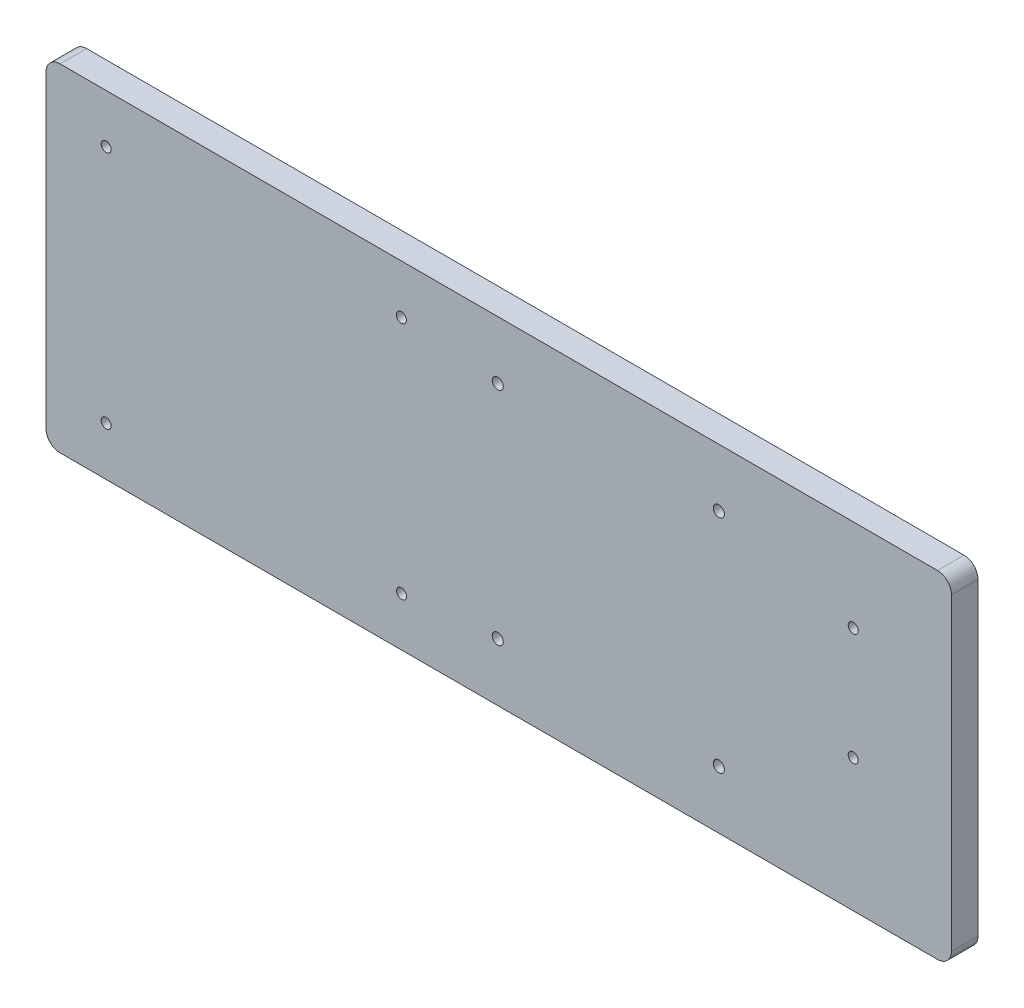
ISO-10303-21;
HEADER;
FILE_DESCRIPTION(('STEP AP214'),'2;1');
FILE_NAME('part.step','',(''),(''),'','','');
FILE_SCHEMA(('AUTOMOTIVE_DESIGN { 1 0 10303 214 1 1 1 1 }'));
ENDSEC;
DATA;
#1=APPLICATION_CONTEXT('core data for automotive mechanical design processes');
#2=APPLICATION_PROTOCOL_DEFINITION('international standard','automotive_design',2000,#1);
#3=PRODUCT_CONTEXT('',#1,'mechanical');
#4=PRODUCT('Part','Part','',(#3));
#5=PRODUCT_RELATED_PRODUCT_CATEGORY('part','',(#4));
#6=PRODUCT_DEFINITION_FORMATION('','',#4);
#7=PRODUCT_DEFINITION_CONTEXT('part definition',#1,'design');
#8=PRODUCT_DEFINITION('design','',#6,#7);
#9=PRODUCT_DEFINITION_SHAPE('','',#8);
#10=(LENGTH_UNIT() NAMED_UNIT(*) SI_UNIT(.MILLI.,.METRE.));
#11=(NAMED_UNIT(*) PLANE_ANGLE_UNIT() SI_UNIT($,.RADIAN.));
#12=(NAMED_UNIT(*) SI_UNIT($,.STERADIAN.) SOLID_ANGLE_UNIT());
#13=UNCERTAINTY_MEASURE_WITH_UNIT(LENGTH_MEASURE(1.E-05),#10,'distance_accuracy_value','');
#14=(GEOMETRIC_REPRESENTATION_CONTEXT(3) GLOBAL_UNCERTAINTY_ASSIGNED_CONTEXT((#13)) GLOBAL_UNIT_ASSIGNED_CONTEXT((#10,
#11,#12)) REPRESENTATION_CONTEXT('',''));
#15=CARTESIAN_POINT('',(0.,0.,0.));
#16=DIRECTION('',(0.,0.,1.));
#17=DIRECTION('',(1.,0.,0.));
#18=AXIS2_PLACEMENT_3D('',#15,#16,#17);
#19=CARTESIAN_POINT('',(3.175,3.175,0.));
#20=DIRECTION('',(0.,0.,-1.));
#21=DIRECTION('',(-1.,0.,0.));
#22=AXIS2_PLACEMENT_3D('',#19,#20,#21);
#23=PLANE('',#22);
#24=CARTESIAN_POINT('',(102.1804,63.1000000000003,0.));
#25=DIRECTION('',(0.,0.,1.));
#26=DIRECTION('',(1.,0.,0.));
#27=AXIS2_PLACEMENT_3D('',#24,#25,#26);
#28=CIRCLE('',#27,1.25);
#29=CARTESIAN_POINT('',(103.4304,63.1000000000003,0.));
#30=VERTEX_POINT('',#29);
#31=EDGE_CURVE('E248',#30,#30,#28,.T.);
#32=ORIENTED_EDGE('',*,*,#31,.T.);
#33=EDGE_LOOP('',(#32));
#34=FACE_BOUND('',#33,.T.);
#35=CARTESIAN_POINT('',(152.1804,63.1000000000004,0.));
#36=DIRECTION('',(0.,0.,1.));
#37=DIRECTION('',(1.,0.,0.));
#38=AXIS2_PLACEMENT_3D('',#35,#36,#37);
#39=CIRCLE('',#38,1.25);
#40=CARTESIAN_POINT('',(153.4304,63.1000000000004,0.));
#41=VERTEX_POINT('',#40);
#42=EDGE_CURVE('E242',#41,#41,#39,.T.);
#43=ORIENTED_EDGE('',*,*,#42,.T.);
#44=EDGE_LOOP('',(#43));
#45=FACE_BOUND('',#44,.T.);
#46=CARTESIAN_POINT('',(152.1804,13.1000000000004,0.));
#47=DIRECTION('',(0.,0.,1.));
#48=DIRECTION('',(1.,0.,0.));
#49=AXIS2_PLACEMENT_3D('',#46,#47,#48);
#50=CIRCLE('',#49,1.25);
#51=CARTESIAN_POINT('',(153.4304,13.1000000000004,0.));
#52=VERTEX_POINT('',#51);
#53=EDGE_CURVE('E236',#52,#52,#50,.T.);
#54=ORIENTED_EDGE('',*,*,#53,.T.);
#55=EDGE_LOOP('',(#54));
#56=FACE_BOUND('',#55,.T.);
#57=CARTESIAN_POINT('',(3.175,3.175,0.));
#58=DIRECTION('',(0.,0.,1.));
#59=DIRECTION('',(-1.,0.,0.));
#60=AXIS2_PLACEMENT_3D('',#57,#58,#59);
#61=CIRCLE('',#60,3.175);
#62=CARTESIAN_POINT('',(0.,3.17500000000002,0.));
#63=VERTEX_POINT('',#62);
#64=CARTESIAN_POINT('',(3.17500000000002,0.,0.));
#65=VERTEX_POINT('',#64);
#66=EDGE_CURVE('E145',#63,#65,#61,.T.);
#67=ORIENTED_EDGE('',*,*,#66,.F.);
#68=DIRECTION('',(0.,-1.,0.));
#69=VECTOR('',#68,1.);
#70=CARTESIAN_POINT('',(0.,3.17500000000002,0.));
#71=LINE('',#70,#69);
#72=CARTESIAN_POINT('',(0.,73.025,0.));
#73=VERTEX_POINT('',#72);
#74=EDGE_CURVE('E99',#73,#63,#71,.T.);
#75=ORIENTED_EDGE('',*,*,#74,.F.);
#76=CARTESIAN_POINT('',(3.175,73.025,0.));
#77=DIRECTION('',(0.,0.,1.));
#78=DIRECTION('',(-1.,0.,0.));
#79=AXIS2_PLACEMENT_3D('',#76,#77,#78);
#80=CIRCLE('',#79,3.175);
#81=CARTESIAN_POINT('',(3.17500000000002,76.2,0.));
#82=VERTEX_POINT('',#81);
#83=EDGE_CURVE('E93',#82,#73,#80,.T.);
#84=ORIENTED_EDGE('',*,*,#83,.F.);
#85=DIRECTION('',(-1.,0.,0.));
#86=VECTOR('',#85,1.);
#87=CARTESIAN_POINT('',(3.17500000000002,76.2,0.));
#88=LINE('',#87,#86);
#89=CARTESIAN_POINT('',(201.6304,76.2,0.));
#90=VERTEX_POINT('',#89);
#91=EDGE_CURVE('E135',#90,#82,#88,.T.);
#92=ORIENTED_EDGE('',*,*,#91,.F.);
#93=CARTESIAN_POINT('',(201.6304,73.025,0.));
#94=DIRECTION('',(0.,0.,1.));
#95=DIRECTION('',(-1.,0.,0.));
#96=AXIS2_PLACEMENT_3D('',#93,#94,#95);
#97=CIRCLE('',#96,3.175);
#98=CARTESIAN_POINT('',(204.8054,73.025,0.));
#99=VERTEX_POINT('',#98);
#100=EDGE_CURVE('E155',#99,#90,#97,.T.);
#101=ORIENTED_EDGE('',*,*,#100,.F.);
#102=DIRECTION('',(0.,1.,0.));
#103=VECTOR('',#102,1.);
#104=CARTESIAN_POINT('',(204.8054,3.17500000000002,0.));
#105=LINE('',#104,#103);
#106=CARTESIAN_POINT('',(204.8054,3.175,0.));
#107=VERTEX_POINT('',#106);
#108=EDGE_CURVE('E153',#107,#99,#105,.T.);
#109=ORIENTED_EDGE('',*,*,#108,.F.);
#110=CARTESIAN_POINT('',(201.6304,3.175,0.));
#111=DIRECTION('',(0.,0.,1.));
#112=DIRECTION('',(1.,0.,0.));
#113=AXIS2_PLACEMENT_3D('',#110,#111,#112);
#114=CIRCLE('',#113,3.17500000000001);
#115=CARTESIAN_POINT('',(201.6304,0.,0.));
#116=VERTEX_POINT('',#115);
#117=EDGE_CURVE('E151',#116,#107,#114,.T.);
#118=ORIENTED_EDGE('',*,*,#117,.F.);
#119=DIRECTION('',(1.,0.,0.));
#120=VECTOR('',#119,1.);
#121=CARTESIAN_POINT('',(3.17500000000002,0.,0.));
#122=LINE('',#121,#120);
#123=EDGE_CURVE('E148',#65,#116,#122,.T.);
#124=ORIENTED_EDGE('',*,*,#123,.F.);
#125=EDGE_LOOP('',(#67,#75,#84,#92,#101,#109,#118,#124));
#126=FACE_BOUND('',#125,.T.);
#127=CARTESIAN_POINT('',(182.5804,55.4000000000007,0.));
#128=DIRECTION('',(0.,0.,1.));
#129=DIRECTION('',(1.,0.,0.));
#130=AXIS2_PLACEMENT_3D('',#127,#128,#129);
#131=CIRCLE('',#130,1.1303);
#132=CARTESIAN_POINT('',(183.7107,55.4000000000007,0.));
#133=VERTEX_POINT('',#132);
#134=EDGE_CURVE('E149',#133,#133,#131,.T.);
#135=ORIENTED_EDGE('',*,*,#134,.T.);
#136=EDGE_LOOP('',(#135));
#137=FACE_BOUND('',#136,.T.);
#138=CARTESIAN_POINT('',(182.5804,30.0000000000007,0.));
#139=DIRECTION('',(0.,0.,1.));
#140=DIRECTION('',(1.,0.,0.));
#141=AXIS2_PLACEMENT_3D('',#138,#139,#140);
#142=CIRCLE('',#141,1.1303);
#143=CARTESIAN_POINT('',(183.7107,30.0000000000007,0.));
#144=VERTEX_POINT('',#143);
#145=EDGE_CURVE('E199',#144,#144,#142,.T.);
#146=ORIENTED_EDGE('',*,*,#145,.T.);
#147=EDGE_LOOP('',(#146));
#148=FACE_BOUND('',#147,.T.);
#149=CARTESIAN_POINT('',(80.3783,65.1383,0.));
#150=DIRECTION('',(0.,0.,1.));
#151=DIRECTION('',(1.,0.,0.));
#152=AXIS2_PLACEMENT_3D('',#149,#150,#151);
#153=CIRCLE('',#152,1.1303);
#154=CARTESIAN_POINT('',(81.5086,65.1383,0.));
#155=VERTEX_POINT('',#154);
#156=EDGE_CURVE('E205',#155,#155,#153,.T.);
#157=ORIENTED_EDGE('',*,*,#156,.T.);
#158=EDGE_LOOP('',(#157));
#159=FACE_BOUND('',#158,.T.);
#160=CARTESIAN_POINT('',(80.4291,11.0617,0.));
#161=DIRECTION('',(0.,0.,1.));
#162=DIRECTION('',(1.,0.,0.));
#163=AXIS2_PLACEMENT_3D('',#160,#161,#162);
#164=CIRCLE('',#163,1.1303);
#165=CARTESIAN_POINT('',(81.5594,11.0617,0.));
#166=VERTEX_POINT('',#165);
#167=EDGE_CURVE('E212',#166,#166,#164,.T.);
#168=ORIENTED_EDGE('',*,*,#167,.T.);
#169=EDGE_LOOP('',(#168));
#170=FACE_BOUND('',#169,.T.);
#171=CARTESIAN_POINT('',(13.6017,11.0363,0.));
#172=DIRECTION('',(0.,0.,1.));
#173=DIRECTION('',(1.,0.,0.));
#174=AXIS2_PLACEMENT_3D('',#171,#172,#173);
#175=CIRCLE('',#174,1.1303);
#176=CARTESIAN_POINT('',(14.732,11.0363,0.));
#177=VERTEX_POINT('',#176);
#178=EDGE_CURVE('E218',#177,#177,#175,.T.);
#179=ORIENTED_EDGE('',*,*,#178,.T.);
#180=EDGE_LOOP('',(#179));
#181=FACE_BOUND('',#180,.T.);
#182=CARTESIAN_POINT('',(13.6017,65.1891,0.));
#183=DIRECTION('',(0.,0.,1.));
#184=DIRECTION('',(1.,0.,0.));
#185=AXIS2_PLACEMENT_3D('',#182,#183,#184);
#186=CIRCLE('',#185,1.1303);
#187=CARTESIAN_POINT('',(14.732,65.1891,0.));
#188=VERTEX_POINT('',#187);
#189=EDGE_CURVE('E224',#188,#188,#186,.T.);
#190=ORIENTED_EDGE('',*,*,#189,.T.);
#191=EDGE_LOOP('',(#190));
#192=FACE_BOUND('',#191,.T.);
#193=CARTESIAN_POINT('',(102.1804,13.1000000000003,0.));
#194=DIRECTION('',(0.,0.,1.));
#195=DIRECTION('',(1.,0.,0.));
#196=AXIS2_PLACEMENT_3D('',#193,#194,#195);
#197=CIRCLE('',#196,1.25);
#198=CARTESIAN_POINT('',(103.4304,13.1000000000003,0.));
#199=VERTEX_POINT('',#198);
#200=EDGE_CURVE('E230',#199,#199,#197,.T.);
#201=ORIENTED_EDGE('',*,*,#200,.T.);
#202=EDGE_LOOP('',(#201));
#203=FACE_BOUND('',#202,.T.);
#204=ADVANCED_FACE('F47',(#34,#45,#56,#126,#137,#148,#159,#170,#181,#192,#203),#23,.T.);
#205=CARTESIAN_POINT('',(3.175,3.175,6.));
#206=DIRECTION('',(0.,0.,-1.));
#207=DIRECTION('',(-1.,0.,0.));
#208=AXIS2_PLACEMENT_3D('',#205,#206,#207);
#209=CYLINDRICAL_SURFACE('',#208,3.175);
#210=ORIENTED_EDGE('',*,*,#66,.T.);
#211=DIRECTION('',(0.,0.,-1.));
#212=VECTOR('',#211,1.);
#213=CARTESIAN_POINT('',(3.17500000000002,0.,6.));
#214=LINE('',#213,#212);
#215=CARTESIAN_POINT('',(3.17500000000002,0.,6.));
#216=VERTEX_POINT('',#215);
#217=EDGE_CURVE('E11',#216,#65,#214,.T.);
#218=ORIENTED_EDGE('',*,*,#217,.F.);
#219=CARTESIAN_POINT('',(3.175,3.175,6.));
#220=DIRECTION('',(0.,0.,1.));
#221=DIRECTION('',(-1.,0.,0.));
#222=AXIS2_PLACEMENT_3D('',#219,#220,#221);
#223=CIRCLE('',#222,3.175);
#224=CARTESIAN_POINT('',(0.,3.17500000000002,6.));
#225=VERTEX_POINT('',#224);
#226=EDGE_CURVE('E161',#225,#216,#223,.T.);
#227=ORIENTED_EDGE('',*,*,#226,.F.);
#228=DIRECTION('',(0.,0.,-1.));
#229=VECTOR('',#228,1.);
#230=CARTESIAN_POINT('',(0.,3.17500000000002,6.));
#231=LINE('',#230,#229);
#232=EDGE_CURVE('E141',#225,#63,#231,.T.);
#233=ORIENTED_EDGE('',*,*,#232,.T.);
#234=EDGE_LOOP('',(#210,#218,#227,#233));
#235=FACE_BOUND('',#234,.T.);
#236=ADVANCED_FACE('F49',(#235),#209,.T.);
#237=CARTESIAN_POINT('',(3.17500000000002,0.,6.));
#238=DIRECTION('',(0.,1.,0.));
#239=DIRECTION('',(0.,0.,1.));
#240=AXIS2_PLACEMENT_3D('',#237,#238,#239);
#241=PLANE('',#240);
#242=ORIENTED_EDGE('',*,*,#123,.T.);
#243=DIRECTION('',(0.,0.,-1.));
#244=VECTOR('',#243,1.);
#245=CARTESIAN_POINT('',(201.6304,0.,6.));
#246=LINE('',#245,#244);
#247=CARTESIAN_POINT('',(201.6304,0.,6.));
#248=VERTEX_POINT('',#247);
#249=EDGE_CURVE('E56',#248,#116,#246,.T.);
#250=ORIENTED_EDGE('',*,*,#249,.F.);
#251=DIRECTION('',(1.,0.,0.));
#252=VECTOR('',#251,1.);
#253=CARTESIAN_POINT('',(3.17500000000002,0.,6.));
#254=LINE('',#253,#252);
#255=EDGE_CURVE('E107',#216,#248,#254,.T.);
#256=ORIENTED_EDGE('',*,*,#255,.F.);
#257=ORIENTED_EDGE('',*,*,#217,.T.);
#258=EDGE_LOOP('',(#242,#250,#256,#257));
#259=FACE_BOUND('',#258,.T.);
#260=ADVANCED_FACE('F298',(#259),#241,.F.);
#261=CARTESIAN_POINT('',(201.6304,3.175,6.));
#262=DIRECTION('',(0.,0.,-1.));
#263=DIRECTION('',(-1.,0.,0.));
#264=AXIS2_PLACEMENT_3D('',#261,#262,#263);
#265=CYLINDRICAL_SURFACE('',#264,3.17500000000001);
#266=ORIENTED_EDGE('',*,*,#117,.T.);
#267=DIRECTION('',(0.,0.,-1.));
#268=VECTOR('',#267,1.);
#269=CARTESIAN_POINT('',(204.8054,3.175,6.));
#270=LINE('',#269,#268);
#271=CARTESIAN_POINT('',(204.8054,3.175,6.));
#272=VERTEX_POINT('',#271);
#273=EDGE_CURVE('E168',#272,#107,#270,.T.);
#274=ORIENTED_EDGE('',*,*,#273,.F.);
#275=CARTESIAN_POINT('',(201.6304,3.175,6.));
#276=DIRECTION('',(0.,0.,1.));
#277=DIRECTION('',(1.,0.,0.));
#278=AXIS2_PLACEMENT_3D('',#275,#276,#277);
#279=CIRCLE('',#278,3.17500000000001);
#280=EDGE_CURVE('E176',#248,#272,#279,.T.);
#281=ORIENTED_EDGE('',*,*,#280,.F.);
#282=ORIENTED_EDGE('',*,*,#249,.T.);
#283=EDGE_LOOP('',(#266,#274,#281,#282));
#284=FACE_BOUND('',#283,.T.);
#285=ADVANCED_FACE('F174',(#284),#265,.T.);
#286=CARTESIAN_POINT('',(204.8054,3.17500000000002,6.));
#287=DIRECTION('',(-1.,0.,0.));
#288=DIRECTION('',(0.,0.,1.));
#289=AXIS2_PLACEMENT_3D('',#286,#287,#288);
#290=PLANE('',#289);
#291=ORIENTED_EDGE('',*,*,#108,.T.);
#292=DIRECTION('',(0.,0.,-1.));
#293=VECTOR('',#292,1.);
#294=CARTESIAN_POINT('',(204.8054,73.025,6.));
#295=LINE('',#294,#293);
#296=CARTESIAN_POINT('',(204.8054,73.025,6.));
#297=VERTEX_POINT('',#296);
#298=EDGE_CURVE('E165',#297,#99,#295,.T.);
#299=ORIENTED_EDGE('',*,*,#298,.F.);
#300=DIRECTION('',(0.,1.,0.));
#301=VECTOR('',#300,1.);
#302=CARTESIAN_POINT('',(204.8054,3.17500000000002,6.));
#303=LINE('',#302,#301);
#304=EDGE_CURVE('E188',#272,#297,#303,.T.);
#305=ORIENTED_EDGE('',*,*,#304,.F.);
#306=ORIENTED_EDGE('',*,*,#273,.T.);
#307=EDGE_LOOP('',(#291,#299,#305,#306));
#308=FACE_BOUND('',#307,.T.);
#309=ADVANCED_FACE('F184',(#308),#290,.F.);
#310=CARTESIAN_POINT('',(201.6304,73.025,6.));
#311=DIRECTION('',(0.,0.,-1.));
#312=DIRECTION('',(-1.,0.,0.));
#313=AXIS2_PLACEMENT_3D('',#310,#311,#312);
#314=CYLINDRICAL_SURFACE('',#313,3.175);
#315=ORIENTED_EDGE('',*,*,#100,.T.);
#316=DIRECTION('',(0.,0.,-1.));
#317=VECTOR('',#316,1.);
#318=CARTESIAN_POINT('',(201.6304,76.2,6.));
#319=LINE('',#318,#317);
#320=CARTESIAN_POINT('',(201.6304,76.2,6.));
#321=VERTEX_POINT('',#320);
#322=EDGE_CURVE('E136',#321,#90,#319,.T.);
#323=ORIENTED_EDGE('',*,*,#322,.F.);
#324=CARTESIAN_POINT('',(201.6304,73.025,6.));
#325=DIRECTION('',(0.,0.,1.));
#326=DIRECTION('',(-1.,0.,0.));
#327=AXIS2_PLACEMENT_3D('',#324,#325,#326);
#328=CIRCLE('',#327,3.175);
#329=EDGE_CURVE('E126',#297,#321,#328,.T.);
#330=ORIENTED_EDGE('',*,*,#329,.F.);
#331=ORIENTED_EDGE('',*,*,#298,.T.);
#332=EDGE_LOOP('',(#315,#323,#330,#331));
#333=FACE_BOUND('',#332,.T.);
#334=ADVANCED_FACE('F187',(#333),#314,.T.);
#335=CARTESIAN_POINT('',(3.17500000000002,76.2,6.));
#336=DIRECTION('',(0.,-1.,0.));
#337=DIRECTION('',(0.,0.,-1.));
#338=AXIS2_PLACEMENT_3D('',#335,#336,#337);
#339=PLANE('',#338);
#340=ORIENTED_EDGE('',*,*,#91,.T.);
#341=DIRECTION('',(0.,0.,-1.));
#342=VECTOR('',#341,1.);
#343=CARTESIAN_POINT('',(3.17500000000002,76.2,6.));
#344=LINE('',#343,#342);
#345=CARTESIAN_POINT('',(3.17500000000002,76.2,6.));
#346=VERTEX_POINT('',#345);
#347=EDGE_CURVE('E132',#346,#82,#344,.T.);
#348=ORIENTED_EDGE('',*,*,#347,.F.);
#349=DIRECTION('',(-1.,0.,0.));
#350=VECTOR('',#349,1.);
#351=CARTESIAN_POINT('',(3.17500000000002,76.2,6.));
#352=LINE('',#351,#350);
#353=EDGE_CURVE('E120',#321,#346,#352,.T.);
#354=ORIENTED_EDGE('',*,*,#353,.F.);
#355=ORIENTED_EDGE('',*,*,#322,.T.);
#356=EDGE_LOOP('',(#340,#348,#354,#355));
#357=FACE_BOUND('',#356,.T.);
#358=ADVANCED_FACE('F133',(#357),#339,.F.);
#359=CARTESIAN_POINT('',(3.175,73.025,6.));
#360=DIRECTION('',(0.,0.,-1.));
#361=DIRECTION('',(-1.,0.,0.));
#362=AXIS2_PLACEMENT_3D('',#359,#360,#361);
#363=CYLINDRICAL_SURFACE('',#362,3.175);
#364=ORIENTED_EDGE('',*,*,#83,.T.);
#365=DIRECTION('',(0.,0.,-1.));
#366=VECTOR('',#365,1.);
#367=CARTESIAN_POINT('',(0.,73.025,6.));
#368=LINE('',#367,#366);
#369=CARTESIAN_POINT('',(0.,73.025,6.));
#370=VERTEX_POINT('',#369);
#371=EDGE_CURVE('E137',#370,#73,#368,.T.);
#372=ORIENTED_EDGE('',*,*,#371,.F.);
#373=CARTESIAN_POINT('',(3.175,73.025,6.));
#374=DIRECTION('',(0.,0.,1.));
#375=DIRECTION('',(-1.,0.,0.));
#376=AXIS2_PLACEMENT_3D('',#373,#374,#375);
#377=CIRCLE('',#376,3.175);
#378=EDGE_CURVE('E124',#346,#370,#377,.T.);
#379=ORIENTED_EDGE('',*,*,#378,.F.);
#380=ORIENTED_EDGE('',*,*,#347,.T.);
#381=EDGE_LOOP('',(#364,#372,#379,#380));
#382=FACE_BOUND('',#381,.T.);
#383=ADVANCED_FACE('F139',(#382),#363,.T.);
#384=CARTESIAN_POINT('',(0.,3.17500000000002,6.));
#385=DIRECTION('',(1.,0.,0.));
#386=DIRECTION('',(0.,0.,-1.));
#387=AXIS2_PLACEMENT_3D('',#384,#385,#386);
#388=PLANE('',#387);
#389=ORIENTED_EDGE('',*,*,#74,.T.);
#390=ORIENTED_EDGE('',*,*,#232,.F.);
#391=DIRECTION('',(0.,-1.,0.));
#392=VECTOR('',#391,1.);
#393=CARTESIAN_POINT('',(0.,3.17500000000002,6.));
#394=LINE('',#393,#392);
#395=EDGE_CURVE('E64',#370,#225,#394,.T.);
#396=ORIENTED_EDGE('',*,*,#395,.F.);
#397=ORIENTED_EDGE('',*,*,#371,.T.);
#398=EDGE_LOOP('',(#389,#390,#396,#397));
#399=FACE_BOUND('',#398,.T.);
#400=ADVANCED_FACE('F261',(#399),#388,.F.);
#401=CARTESIAN_POINT('',(3.175,3.175,6.));
#402=DIRECTION('',(0.,0.,-1.));
#403=DIRECTION('',(-1.,0.,0.));
#404=AXIS2_PLACEMENT_3D('',#401,#402,#403);
#405=PLANE('',#404);
#406=CARTESIAN_POINT('',(102.1804,63.1000000000003,6.));
#407=DIRECTION('',(0.,0.,1.));
#408=DIRECTION('',(1.,0.,0.));
#409=AXIS2_PLACEMENT_3D('',#406,#407,#408);
#410=CIRCLE('',#409,1.25);
#411=CARTESIAN_POINT('',(103.4304,63.1000000000003,6.));
#412=VERTEX_POINT('',#411);
#413=EDGE_CURVE('E251',#412,#412,#410,.T.);
#414=ORIENTED_EDGE('',*,*,#413,.F.);
#415=EDGE_LOOP('',(#414));
#416=FACE_BOUND('',#415,.T.);
#417=CARTESIAN_POINT('',(152.1804,63.1000000000004,6.));
#418=DIRECTION('',(0.,0.,1.));
#419=DIRECTION('',(1.,0.,0.));
#420=AXIS2_PLACEMENT_3D('',#417,#418,#419);
#421=CIRCLE('',#420,1.25);
#422=CARTESIAN_POINT('',(153.4304,63.1000000000004,6.));
#423=VERTEX_POINT('',#422);
#424=EDGE_CURVE('E245',#423,#423,#421,.T.);
#425=ORIENTED_EDGE('',*,*,#424,.F.);
#426=EDGE_LOOP('',(#425));
#427=FACE_BOUND('',#426,.T.);
#428=CARTESIAN_POINT('',(152.1804,13.1000000000004,6.));
#429=DIRECTION('',(0.,0.,1.));
#430=DIRECTION('',(1.,0.,0.));
#431=AXIS2_PLACEMENT_3D('',#428,#429,#430);
#432=CIRCLE('',#431,1.25);
#433=CARTESIAN_POINT('',(153.4304,13.1000000000004,6.));
#434=VERTEX_POINT('',#433);
#435=EDGE_CURVE('E239',#434,#434,#432,.T.);
#436=ORIENTED_EDGE('',*,*,#435,.F.);
#437=EDGE_LOOP('',(#436));
#438=FACE_BOUND('',#437,.T.);
#439=CARTESIAN_POINT('',(102.1804,13.1000000000003,6.));
#440=DIRECTION('',(0.,0.,1.));
#441=DIRECTION('',(1.,0.,0.));
#442=AXIS2_PLACEMENT_3D('',#439,#440,#441);
#443=CIRCLE('',#442,1.25);
#444=CARTESIAN_POINT('',(103.4304,13.1000000000003,6.));
#445=VERTEX_POINT('',#444);
#446=EDGE_CURVE('E233',#445,#445,#443,.T.);
#447=ORIENTED_EDGE('',*,*,#446,.F.);
#448=EDGE_LOOP('',(#447));
#449=FACE_BOUND('',#448,.T.);
#450=CARTESIAN_POINT('',(13.6017,65.1891,6.));
#451=DIRECTION('',(0.,0.,1.));
#452=DIRECTION('',(1.,0.,0.));
#453=AXIS2_PLACEMENT_3D('',#450,#451,#452);
#454=CIRCLE('',#453,1.1303);
#455=CARTESIAN_POINT('',(14.732,65.1891,6.));
#456=VERTEX_POINT('',#455);
#457=EDGE_CURVE('E227',#456,#456,#454,.T.);
#458=ORIENTED_EDGE('',*,*,#457,.F.);
#459=EDGE_LOOP('',(#458));
#460=FACE_BOUND('',#459,.T.);
#461=CARTESIAN_POINT('',(13.6017,11.0363,6.));
#462=DIRECTION('',(0.,0.,1.));
#463=DIRECTION('',(1.,0.,0.));
#464=AXIS2_PLACEMENT_3D('',#461,#462,#463);
#465=CIRCLE('',#464,1.1303);
#466=CARTESIAN_POINT('',(14.732,11.0363,6.));
#467=VERTEX_POINT('',#466);
#468=EDGE_CURVE('E221',#467,#467,#465,.T.);
#469=ORIENTED_EDGE('',*,*,#468,.F.);
#470=EDGE_LOOP('',(#469));
#471=FACE_BOUND('',#470,.T.);
#472=CARTESIAN_POINT('',(80.4291,11.0617,6.));
#473=DIRECTION('',(0.,0.,1.));
#474=DIRECTION('',(1.,0.,0.));
#475=AXIS2_PLACEMENT_3D('',#472,#473,#474);
#476=CIRCLE('',#475,1.1303);
#477=CARTESIAN_POINT('',(81.5594,11.0617,6.));
#478=VERTEX_POINT('',#477);
#479=EDGE_CURVE('E215',#478,#478,#476,.T.);
#480=ORIENTED_EDGE('',*,*,#479,.F.);
#481=EDGE_LOOP('',(#480));
#482=FACE_BOUND('',#481,.T.);
#483=CARTESIAN_POINT('',(80.3783,65.1383,6.));
#484=DIRECTION('',(0.,0.,1.));
#485=DIRECTION('',(1.,0.,0.));
#486=AXIS2_PLACEMENT_3D('',#483,#484,#485);
#487=CIRCLE('',#486,1.1303);
#488=CARTESIAN_POINT('',(81.5086,65.1383,6.));
#489=VERTEX_POINT('',#488);
#490=EDGE_CURVE('E208',#489,#489,#487,.T.);
#491=ORIENTED_EDGE('',*,*,#490,.F.);
#492=EDGE_LOOP('',(#491));
#493=FACE_BOUND('',#492,.T.);
#494=CARTESIAN_POINT('',(182.5804,30.0000000000007,6.));
#495=DIRECTION('',(0.,0.,1.));
#496=DIRECTION('',(1.,0.,0.));
#497=AXIS2_PLACEMENT_3D('',#494,#495,#496);
#498=CIRCLE('',#497,1.1303);
#499=CARTESIAN_POINT('',(183.7107,30.0000000000007,6.));
#500=VERTEX_POINT('',#499);
#501=EDGE_CURVE('E202',#500,#500,#498,.T.);
#502=ORIENTED_EDGE('',*,*,#501,.F.);
#503=EDGE_LOOP('',(#502));
#504=FACE_BOUND('',#503,.T.);
#505=CARTESIAN_POINT('',(182.5804,55.4000000000007,6.));
#506=DIRECTION('',(0.,0.,1.));
#507=DIRECTION('',(1.,0.,0.));
#508=AXIS2_PLACEMENT_3D('',#505,#506,#507);
#509=CIRCLE('',#508,1.1303);
#510=CARTESIAN_POINT('',(183.7107,55.4000000000007,6.));
#511=VERTEX_POINT('',#510);
#512=EDGE_CURVE('E196',#511,#511,#509,.T.);
#513=ORIENTED_EDGE('',*,*,#512,.F.);
#514=EDGE_LOOP('',(#513));
#515=FACE_BOUND('',#514,.T.);
#516=ORIENTED_EDGE('',*,*,#226,.T.);
#517=ORIENTED_EDGE('',*,*,#255,.T.);
#518=ORIENTED_EDGE('',*,*,#280,.T.);
#519=ORIENTED_EDGE('',*,*,#304,.T.);
#520=ORIENTED_EDGE('',*,*,#329,.T.);
#521=ORIENTED_EDGE('',*,*,#353,.T.);
#522=ORIENTED_EDGE('',*,*,#378,.T.);
#523=ORIENTED_EDGE('',*,*,#395,.T.);
#524=EDGE_LOOP('',(#516,#517,#518,#519,#520,#521,#522,#523));
#525=FACE_BOUND('',#524,.T.);
#526=ADVANCED_FACE('F122',(#416,#427,#438,#449,#460,#471,#482,#493,#504,#515,#525),#405,.F.);
#527=CARTESIAN_POINT('',(182.5804,55.4000000000007,6.));
#528=DIRECTION('',(0.,0.,1.));
#529=DIRECTION('',(1.,0.,0.));
#530=AXIS2_PLACEMENT_3D('',#527,#528,#529);
#531=CYLINDRICAL_SURFACE('',#530,1.1303);
#532=ORIENTED_EDGE('',*,*,#134,.F.);
#533=EDGE_LOOP('',(#532));
#534=FACE_BOUND('',#533,.T.);
#535=ORIENTED_EDGE('',*,*,#512,.T.);
#536=EDGE_LOOP('',(#535));
#537=FACE_BOUND('',#536,.T.);
#538=ADVANCED_FACE('F260',(#534,#537),#531,.F.);
#539=CARTESIAN_POINT('',(182.5804,30.0000000000007,6.));
#540=DIRECTION('',(0.,0.,1.));
#541=DIRECTION('',(1.,0.,0.));
#542=AXIS2_PLACEMENT_3D('',#539,#540,#541);
#543=CYLINDRICAL_SURFACE('',#542,1.1303);
#544=ORIENTED_EDGE('',*,*,#145,.F.);
#545=EDGE_LOOP('',(#544));
#546=FACE_BOUND('',#545,.T.);
#547=ORIENTED_EDGE('',*,*,#501,.T.);
#548=EDGE_LOOP('',(#547));
#549=FACE_BOUND('',#548,.T.);
#550=ADVANCED_FACE('F282',(#546,#549),#543,.F.);
#551=CARTESIAN_POINT('',(80.3783,65.1383,6.));
#552=DIRECTION('',(0.,0.,1.));
#553=DIRECTION('',(1.,0.,0.));
#554=AXIS2_PLACEMENT_3D('',#551,#552,#553);
#555=CYLINDRICAL_SURFACE('',#554,1.1303);
#556=ORIENTED_EDGE('',*,*,#156,.F.);
#557=EDGE_LOOP('',(#556));
#558=FACE_BOUND('',#557,.T.);
#559=ORIENTED_EDGE('',*,*,#490,.T.);
#560=EDGE_LOOP('',(#559));
#561=FACE_BOUND('',#560,.T.);
#562=ADVANCED_FACE('F289',(#558,#561),#555,.F.);
#563=CARTESIAN_POINT('',(80.4291,11.0617,6.));
#564=DIRECTION('',(0.,0.,1.));
#565=DIRECTION('',(1.,0.,0.));
#566=AXIS2_PLACEMENT_3D('',#563,#564,#565);
#567=CYLINDRICAL_SURFACE('',#566,1.1303);
#568=ORIENTED_EDGE('',*,*,#167,.F.);
#569=EDGE_LOOP('',(#568));
#570=FACE_BOUND('',#569,.T.);
#571=ORIENTED_EDGE('',*,*,#479,.T.);
#572=EDGE_LOOP('',(#571));
#573=FACE_BOUND('',#572,.T.);
#574=ADVANCED_FACE('F371',(#570,#573),#567,.F.);
#575=CARTESIAN_POINT('',(13.6017,11.0363,6.));
#576=DIRECTION('',(0.,0.,1.));
#577=DIRECTION('',(1.,0.,0.));
#578=AXIS2_PLACEMENT_3D('',#575,#576,#577);
#579=CYLINDRICAL_SURFACE('',#578,1.1303);
#580=ORIENTED_EDGE('',*,*,#178,.F.);
#581=EDGE_LOOP('',(#580));
#582=FACE_BOUND('',#581,.T.);
#583=ORIENTED_EDGE('',*,*,#468,.T.);
#584=EDGE_LOOP('',(#583));
#585=FACE_BOUND('',#584,.T.);
#586=ADVANCED_FACE('F382',(#582,#585),#579,.F.);
#587=CARTESIAN_POINT('',(13.6017,65.1891,6.));
#588=DIRECTION('',(0.,0.,1.));
#589=DIRECTION('',(1.,0.,0.));
#590=AXIS2_PLACEMENT_3D('',#587,#588,#589);
#591=CYLINDRICAL_SURFACE('',#590,1.1303);
#592=ORIENTED_EDGE('',*,*,#189,.F.);
#593=EDGE_LOOP('',(#592));
#594=FACE_BOUND('',#593,.T.);
#595=ORIENTED_EDGE('',*,*,#457,.T.);
#596=EDGE_LOOP('',(#595));
#597=FACE_BOUND('',#596,.T.);
#598=ADVANCED_FACE('F393',(#594,#597),#591,.F.);
#599=CARTESIAN_POINT('',(102.1804,13.1000000000003,6.));
#600=DIRECTION('',(0.,0.,1.));
#601=DIRECTION('',(1.,0.,0.));
#602=AXIS2_PLACEMENT_3D('',#599,#600,#601);
#603=CYLINDRICAL_SURFACE('',#602,1.25);
#604=ORIENTED_EDGE('',*,*,#200,.F.);
#605=EDGE_LOOP('',(#604));
#606=FACE_BOUND('',#605,.T.);
#607=ORIENTED_EDGE('',*,*,#446,.T.);
#608=EDGE_LOOP('',(#607));
#609=FACE_BOUND('',#608,.T.);
#610=ADVANCED_FACE('F403',(#606,#609),#603,.F.);
#611=CARTESIAN_POINT('',(152.1804,13.1000000000004,6.));
#612=DIRECTION('',(0.,0.,1.));
#613=DIRECTION('',(1.,0.,0.));
#614=AXIS2_PLACEMENT_3D('',#611,#612,#613);
#615=CYLINDRICAL_SURFACE('',#614,1.25);
#616=ORIENTED_EDGE('',*,*,#53,.F.);
#617=EDGE_LOOP('',(#616));
#618=FACE_BOUND('',#617,.T.);
#619=ORIENTED_EDGE('',*,*,#435,.T.);
#620=EDGE_LOOP('',(#619));
#621=FACE_BOUND('',#620,.T.);
#622=ADVANCED_FACE('F424',(#618,#621),#615,.F.);
#623=CARTESIAN_POINT('',(152.1804,63.1000000000004,6.));
#624=DIRECTION('',(0.,0.,1.));
#625=DIRECTION('',(1.,0.,0.));
#626=AXIS2_PLACEMENT_3D('',#623,#624,#625);
#627=CYLINDRICAL_SURFACE('',#626,1.25);
#628=ORIENTED_EDGE('',*,*,#42,.F.);
#629=EDGE_LOOP('',(#628));
#630=FACE_BOUND('',#629,.T.);
#631=ORIENTED_EDGE('',*,*,#424,.T.);
#632=EDGE_LOOP('',(#631));
#633=FACE_BOUND('',#632,.T.);
#634=ADVANCED_FACE('F434',(#630,#633),#627,.F.);
#635=CARTESIAN_POINT('',(102.1804,63.1000000000003,6.));
#636=DIRECTION('',(0.,0.,1.));
#637=DIRECTION('',(1.,0.,0.));
#638=AXIS2_PLACEMENT_3D('',#635,#636,#637);
#639=CYLINDRICAL_SURFACE('',#638,1.25);
#640=ORIENTED_EDGE('',*,*,#31,.F.);
#641=EDGE_LOOP('',(#640));
#642=FACE_BOUND('',#641,.T.);
#643=ORIENTED_EDGE('',*,*,#413,.T.);
#644=EDGE_LOOP('',(#643));
#645=FACE_BOUND('',#644,.T.);
#646=ADVANCED_FACE('F256',(#642,#645),#639,.F.);
#647=CLOSED_SHELL('',(#204,#236,#260,#285,#309,#334,#358,#383,#400,#526,#538,#550,#562,#574,
#586,#598,#610,#622,#634,#646));
#648=MANIFOLD_SOLID_BREP('B2',#647);
#649=ADVANCED_BREP_SHAPE_REPRESENTATION('',(#18,#648),#14);
#650=SHAPE_DEFINITION_REPRESENTATION(#9,#649);
ENDSEC;
END-ISO-10303-21;
